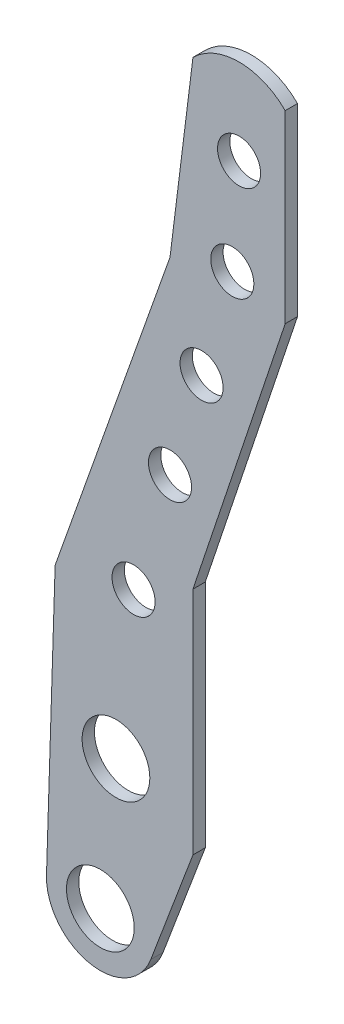
ISO-10303-21;
HEADER;
FILE_DESCRIPTION(('STEP AP214'),'2;1');
FILE_NAME('part.step','',(''),(''),'','','');
FILE_SCHEMA(('AUTOMOTIVE_DESIGN { 1 0 10303 214 1 1 1 1 }'));
ENDSEC;
DATA;
#1=APPLICATION_CONTEXT('core data for automotive mechanical design processes');
#2=APPLICATION_PROTOCOL_DEFINITION('international standard','automotive_design',2000,#1);
#3=PRODUCT_CONTEXT('',#1,'mechanical');
#4=PRODUCT('Part','Part','',(#3));
#5=PRODUCT_RELATED_PRODUCT_CATEGORY('part','',(#4));
#6=PRODUCT_DEFINITION_FORMATION('','',#4);
#7=PRODUCT_DEFINITION_CONTEXT('part definition',#1,'design');
#8=PRODUCT_DEFINITION('design','',#6,#7);
#9=PRODUCT_DEFINITION_SHAPE('','',#8);
#10=(LENGTH_UNIT() NAMED_UNIT(*) SI_UNIT(.MILLI.,.METRE.));
#11=(NAMED_UNIT(*) PLANE_ANGLE_UNIT() SI_UNIT($,.RADIAN.));
#12=(NAMED_UNIT(*) SI_UNIT($,.STERADIAN.) SOLID_ANGLE_UNIT());
#13=UNCERTAINTY_MEASURE_WITH_UNIT(LENGTH_MEASURE(1.E-05),#10,'distance_accuracy_value','');
#14=(GEOMETRIC_REPRESENTATION_CONTEXT(3) GLOBAL_UNCERTAINTY_ASSIGNED_CONTEXT((#13)) GLOBAL_UNIT_ASSIGNED_CONTEXT((#10,
#11,#12)) REPRESENTATION_CONTEXT('',''));
#15=CARTESIAN_POINT('',(0.,0.,0.));
#16=DIRECTION('',(0.,0.,1.));
#17=DIRECTION('',(1.,0.,0.));
#18=AXIS2_PLACEMENT_3D('',#15,#16,#17);
#19=CARTESIAN_POINT('',(0.,0.,4.));
#20=DIRECTION('',(0.,0.,1.));
#21=DIRECTION('',(1.,0.,0.));
#22=AXIS2_PLACEMENT_3D('',#19,#20,#21);
#23=PLANE('',#22);
#24=CARTESIAN_POINT('',(10.7924524437205,95.075946030546,4.));
#25=DIRECTION('',(0.,0.,1.));
#26=DIRECTION('',(1.,0.,0.));
#27=AXIS2_PLACEMENT_3D('',#24,#25,#26);
#28=CIRCLE('',#27,7.00000000000001);
#29=CARTESIAN_POINT('',(17.7924524437206,95.075946030546,4.));
#30=VERTEX_POINT('',#29);
#31=EDGE_CURVE('E224',#30,#30,#28,.T.);
#32=ORIENTED_EDGE('',*,*,#31,.F.);
#33=EDGE_LOOP('',(#32));
#34=FACE_BOUND('',#33,.T.);
#35=CARTESIAN_POINT('',(32.8774007978409,166.36480953983,4.));
#36=DIRECTION('',(0.,0.,1.));
#37=DIRECTION('',(1.,0.,0.));
#38=AXIS2_PLACEMENT_3D('',#35,#36,#37);
#39=CIRCLE('',#38,7.);
#40=CARTESIAN_POINT('',(39.8774007978409,166.36480953983,4.));
#41=VERTEX_POINT('',#40);
#42=EDGE_CURVE('E212',#41,#41,#39,.T.);
#43=ORIENTED_EDGE('',*,*,#42,.F.);
#44=EDGE_LOOP('',(#43));
#45=FACE_BOUND('',#44,.T.);
#46=CARTESIAN_POINT('',(45.0583199970409,232.78813399543,4.));
#47=DIRECTION('',(0.,0.,1.));
#48=DIRECTION('',(1.,0.,0.));
#49=AXIS2_PLACEMENT_3D('',#46,#47,#48);
#50=CIRCLE('',#49,7.);
#51=CARTESIAN_POINT('',(52.0583199970409,232.78813399543,4.));
#52=VERTEX_POINT('',#51);
#53=EDGE_CURVE('E200',#52,#52,#50,.T.);
#54=ORIENTED_EDGE('',*,*,#53,.F.);
#55=EDGE_LOOP('',(#54));
#56=FACE_BOUND('',#55,.T.);
#57=DIRECTION('',(0.353372708393335,0.935482618204507,0.));
#58=VECTOR('',#57,1.);
#59=CARTESIAN_POINT('',(30.0781034684177,30.1028990937833,4.));
#60=LINE('',#59,#58);
#61=CARTESIAN_POINT('',(16.3709458185789,-6.18402239688336,4.));
#62=VERTEX_POINT('',#61);
#63=CARTESIAN_POINT('',(30.0781034684177,30.1028990937833,4.));
#64=VERTEX_POINT('',#63);
#65=EDGE_CURVE('E154',#62,#64,#60,.T.);
#66=ORIENTED_EDGE('',*,*,#65,.T.);
#67=DIRECTION('',(0.,1.,0.));
#68=VECTOR('',#67,1.);
#69=CARTESIAN_POINT('',(30.0781034684177,30.1028990937833,4.));
#70=LINE('',#69,#68);
#71=CARTESIAN_POINT('',(30.0781034684177,104.85863758602,4.));
#72=VERTEX_POINT('',#71);
#73=EDGE_CURVE('E96',#64,#72,#70,.T.);
#74=ORIENTED_EDGE('',*,*,#73,.T.);
#75=DIRECTION('',(0.317032234566605,0.948414762772968,0.));
#76=VECTOR('',#75,1.);
#77=CARTESIAN_POINT('',(30.0781034684177,104.85863758602,4.));
#78=LINE('',#77,#76);
#79=CARTESIAN_POINT('',(60.0385365440409,194.48648593543,4.));
#80=VERTEX_POINT('',#79);
#81=EDGE_CURVE('E171',#72,#80,#78,.T.);
#82=ORIENTED_EDGE('',*,*,#81,.T.);
#83=DIRECTION('',(0.,1.,0.));
#84=VECTOR('',#83,1.);
#85=CARTESIAN_POINT('',(60.0385365440409,194.48648593543,4.));
#86=LINE('',#85,#84);
#87=CARTESIAN_POINT('',(60.0385365440409,254.427096014094,4.));
#88=VERTEX_POINT('',#87);
#89=EDGE_CURVE('E190',#80,#88,#86,.T.);
#90=ORIENTED_EDGE('',*,*,#89,.T.);
#91=CARTESIAN_POINT('',(45.0583199990302,239.446879477041,4.));
#92=DIRECTION('',(0.,0.,1.));
#93=DIRECTION('',(1.,0.,0.));
#94=AXIS2_PLACEMENT_3D('',#91,#92,#93);
#95=CIRCLE('',#94,21.1852253996133);
#96=CARTESIAN_POINT('',(30.0781034688333,254.427096028908,4.));
#97=VERTEX_POINT('',#96);
#98=EDGE_CURVE('E189',#88,#97,#95,.T.);
#99=ORIENTED_EDGE('',*,*,#98,.T.);
#100=DIRECTION('',(-0.123321737923212,-0.992366741157521,0.));
#101=VECTOR('',#100,1.);
#102=CARTESIAN_POINT('',(30.0781034688333,254.427096028908,4.));
#103=LINE('',#102,#101);
#104=CARTESIAN_POINT('',(22.6292643404076,194.486485916155,4.));
#105=VERTEX_POINT('',#104);
#106=EDGE_CURVE('E118',#97,#105,#103,.T.);
#107=ORIENTED_EDGE('',*,*,#106,.T.);
#108=DIRECTION('',(-0.334121974201787,-0.942529843747932,0.));
#109=VECTOR('',#108,1.);
#110=CARTESIAN_POINT('',(22.6292643404076,194.486485916155,4.));
#111=LINE('',#110,#109);
#112=CARTESIAN_POINT('',(-14.6833356527591,89.23079560903,4.));
#113=VERTEX_POINT('',#112);
#114=EDGE_CURVE('E112',#105,#113,#111,.T.);
#115=ORIENTED_EDGE('',*,*,#114,.T.);
#116=DIRECTION('',(-0.0316484884133596,-0.999499061120694,0.));
#117=VECTOR('',#116,1.);
#118=CARTESIAN_POINT('',(-14.6833356527591,89.23079560903,4.));
#119=LINE('',#118,#117);
#120=CARTESIAN_POINT('',(-17.4912335696121,0.553848547233794,4.));
#121=VERTEX_POINT('',#120);
#122=EDGE_CURVE('E116',#113,#121,#119,.T.);
#123=ORIENTED_EDGE('',*,*,#122,.T.);
#124=CARTESIAN_POINT('',(0.,0.,4.));
#125=DIRECTION('',(0.,0.,1.));
#126=DIRECTION('',(1.,0.,0.));
#127=AXIS2_PLACEMENT_3D('',#124,#125,#126);
#128=CIRCLE('',#127,17.5);
#129=EDGE_CURVE('E50',#121,#62,#128,.T.);
#130=ORIENTED_EDGE('',*,*,#129,.T.);
#131=EDGE_LOOP('',(#66,#74,#82,#90,#99,#107,#115,#123,#130));
#132=FACE_BOUND('',#131,.T.);
#133=CARTESIAN_POINT('',(0.,0.,4.));
#134=DIRECTION('',(0.,0.,1.));
#135=DIRECTION('',(1.,0.,0.));
#136=AXIS2_PLACEMENT_3D('',#133,#134,#135);
#137=CIRCLE('',#136,11.);
#138=CARTESIAN_POINT('',(11.,0.,4.));
#139=VERTEX_POINT('',#138);
#140=EDGE_CURVE('E140',#139,#139,#137,.T.);
#141=ORIENTED_EDGE('',*,*,#140,.F.);
#142=EDGE_LOOP('',(#141));
#143=FACE_BOUND('',#142,.T.);
#144=CARTESIAN_POINT('',(42.8551534102409,200.57424703903,4.));
#145=DIRECTION('',(0.,0.,1.));
#146=DIRECTION('',(1.,0.,0.));
#147=AXIS2_PLACEMENT_3D('',#144,#145,#146);
#148=CIRCLE('',#147,7.);
#149=CARTESIAN_POINT('',(49.8551534102409,200.57424703903,4.));
#150=VERTEX_POINT('',#149);
#151=EDGE_CURVE('E206',#150,#150,#148,.T.);
#152=ORIENTED_EDGE('',*,*,#151,.F.);
#153=EDGE_LOOP('',(#152));
#154=FACE_BOUND('',#153,.T.);
#155=CARTESIAN_POINT('',(22.6292643472409,133.28445141823,4.));
#156=DIRECTION('',(0.,0.,1.));
#157=DIRECTION('',(1.,0.,0.));
#158=AXIS2_PLACEMENT_3D('',#155,#156,#157);
#159=CIRCLE('',#158,7.);
#160=CARTESIAN_POINT('',(29.6292643472409,133.28445141823,4.));
#161=VERTEX_POINT('',#160);
#162=EDGE_CURVE('E218',#161,#161,#159,.T.);
#163=ORIENTED_EDGE('',*,*,#162,.F.);
#164=EDGE_LOOP('',(#163));
#165=FACE_BOUND('',#164,.T.);
#166=CARTESIAN_POINT('',(5.07553514772115,44.7128498640407,4.));
#167=DIRECTION('',(0.,0.,1.));
#168=DIRECTION('',(1.,0.,0.));
#169=AXIS2_PLACEMENT_3D('',#166,#167,#168);
#170=CIRCLE('',#169,11.);
#171=CARTESIAN_POINT('',(16.0755351477212,44.7128498640407,4.));
#172=VERTEX_POINT('',#171);
#173=EDGE_CURVE('E230',#172,#172,#170,.T.);
#174=ORIENTED_EDGE('',*,*,#173,.F.);
#175=EDGE_LOOP('',(#174));
#176=FACE_BOUND('',#175,.T.);
#177=ADVANCED_FACE('F33',(#34,#45,#56,#132,#143,#154,#165,#176),#23,.T.);
#178=CARTESIAN_POINT('',(0.,0.,0.));
#179=DIRECTION('',(0.,0.,1.));
#180=DIRECTION('',(1.,0.,0.));
#181=AXIS2_PLACEMENT_3D('',#178,#179,#180);
#182=PLANE('',#181);
#183=DIRECTION('',(0.353372708393335,0.935482618204507,0.));
#184=VECTOR('',#183,1.);
#185=CARTESIAN_POINT('',(30.0781034684177,30.1028990937833,0.));
#186=LINE('',#185,#184);
#187=CARTESIAN_POINT('',(16.3709458185789,-6.18402239688336,0.));
#188=VERTEX_POINT('',#187);
#189=CARTESIAN_POINT('',(30.0781034684177,30.1028990937833,0.));
#190=VERTEX_POINT('',#189);
#191=EDGE_CURVE('E136',#188,#190,#186,.T.);
#192=ORIENTED_EDGE('',*,*,#191,.F.);
#193=CARTESIAN_POINT('',(0.,0.,0.));
#194=DIRECTION('',(0.,0.,1.));
#195=DIRECTION('',(1.,0.,0.));
#196=AXIS2_PLACEMENT_3D('',#193,#194,#195);
#197=CIRCLE('',#196,17.5);
#198=CARTESIAN_POINT('',(-17.4912335696121,0.553848547233794,0.));
#199=VERTEX_POINT('',#198);
#200=EDGE_CURVE('E88',#199,#188,#197,.T.);
#201=ORIENTED_EDGE('',*,*,#200,.F.);
#202=DIRECTION('',(-0.0316484884133596,-0.999499061120694,0.));
#203=VECTOR('',#202,1.);
#204=CARTESIAN_POINT('',(-14.6833356527591,89.23079560903,0.));
#205=LINE('',#204,#203);
#206=CARTESIAN_POINT('',(-14.6833356527591,89.23079560903,0.));
#207=VERTEX_POINT('',#206);
#208=EDGE_CURVE('E82',#207,#199,#205,.T.);
#209=ORIENTED_EDGE('',*,*,#208,.F.);
#210=DIRECTION('',(-0.334121974201787,-0.942529843747932,0.));
#211=VECTOR('',#210,1.);
#212=CARTESIAN_POINT('',(22.6292643404076,194.486485916155,0.));
#213=LINE('',#212,#211);
#214=CARTESIAN_POINT('',(22.6292643404076,194.486485916155,0.));
#215=VERTEX_POINT('',#214);
#216=EDGE_CURVE('E126',#215,#207,#213,.T.);
#217=ORIENTED_EDGE('',*,*,#216,.F.);
#218=DIRECTION('',(-0.123321737923212,-0.992366741157521,0.));
#219=VECTOR('',#218,1.);
#220=CARTESIAN_POINT('',(30.0781034688333,254.427096028908,0.));
#221=LINE('',#220,#219);
#222=CARTESIAN_POINT('',(30.0781034688333,254.427096028908,0.));
#223=VERTEX_POINT('',#222);
#224=EDGE_CURVE('E149',#223,#215,#221,.T.);
#225=ORIENTED_EDGE('',*,*,#224,.F.);
#226=CARTESIAN_POINT('',(45.0583199990302,239.446879477041,0.));
#227=DIRECTION('',(0.,0.,1.));
#228=DIRECTION('',(1.,0.,0.));
#229=AXIS2_PLACEMENT_3D('',#226,#227,#228);
#230=CIRCLE('',#229,21.1852253996133);
#231=CARTESIAN_POINT('',(60.0385365440409,254.427096014094,0.));
#232=VERTEX_POINT('',#231);
#233=EDGE_CURVE('E147',#232,#223,#230,.T.);
#234=ORIENTED_EDGE('',*,*,#233,.F.);
#235=DIRECTION('',(0.,1.,0.));
#236=VECTOR('',#235,1.);
#237=CARTESIAN_POINT('',(60.0385365440409,194.48648593543,0.));
#238=LINE('',#237,#236);
#239=CARTESIAN_POINT('',(60.0385365440409,194.48648593543,0.));
#240=VERTEX_POINT('',#239);
#241=EDGE_CURVE('E145',#240,#232,#238,.T.);
#242=ORIENTED_EDGE('',*,*,#241,.F.);
#243=DIRECTION('',(0.317032234316667,0.948414762856516,0.));
#244=VECTOR('',#243,1.);
#245=CARTESIAN_POINT('',(43.6562346884409,145.47816675643,0.));
#246=LINE('',#245,#244);
#247=CARTESIAN_POINT('',(30.0781034684177,104.85863758602,0.));
#248=VERTEX_POINT('',#247);
#249=EDGE_CURVE('E143',#248,#240,#246,.T.);
#250=ORIENTED_EDGE('',*,*,#249,.F.);
#251=DIRECTION('',(0.,1.,0.));
#252=VECTOR('',#251,1.);
#253=CARTESIAN_POINT('',(30.0781034684177,30.1028990937833,0.));
#254=LINE('',#253,#252);
#255=EDGE_CURVE('E139',#190,#248,#254,.T.);
#256=ORIENTED_EDGE('',*,*,#255,.F.);
#257=EDGE_LOOP('',(#192,#201,#209,#217,#225,#234,#242,#250,#256));
#258=FACE_BOUND('',#257,.T.);
#259=CARTESIAN_POINT('',(0.,0.,0.));
#260=DIRECTION('',(0.,0.,1.));
#261=DIRECTION('',(1.,0.,0.));
#262=AXIS2_PLACEMENT_3D('',#259,#260,#261);
#263=CIRCLE('',#262,11.);
#264=CARTESIAN_POINT('',(11.,0.,0.));
#265=VERTEX_POINT('',#264);
#266=EDGE_CURVE('E197',#265,#265,#263,.T.);
#267=ORIENTED_EDGE('',*,*,#266,.T.);
#268=EDGE_LOOP('',(#267));
#269=FACE_BOUND('',#268,.T.);
#270=CARTESIAN_POINT('',(45.0583199970409,232.78813399543,0.));
#271=DIRECTION('',(0.,0.,1.));
#272=DIRECTION('',(1.,0.,0.));
#273=AXIS2_PLACEMENT_3D('',#270,#271,#272);
#274=CIRCLE('',#273,7.);
#275=CARTESIAN_POINT('',(52.0583199970409,232.78813399543,0.));
#276=VERTEX_POINT('',#275);
#277=EDGE_CURVE('E203',#276,#276,#274,.T.);
#278=ORIENTED_EDGE('',*,*,#277,.T.);
#279=EDGE_LOOP('',(#278));
#280=FACE_BOUND('',#279,.T.);
#281=CARTESIAN_POINT('',(42.8551534102409,200.57424703903,0.));
#282=DIRECTION('',(0.,0.,1.));
#283=DIRECTION('',(1.,0.,0.));
#284=AXIS2_PLACEMENT_3D('',#281,#282,#283);
#285=CIRCLE('',#284,7.);
#286=CARTESIAN_POINT('',(49.8551534102409,200.57424703903,0.));
#287=VERTEX_POINT('',#286);
#288=EDGE_CURVE('E209',#287,#287,#285,.T.);
#289=ORIENTED_EDGE('',*,*,#288,.T.);
#290=EDGE_LOOP('',(#289));
#291=FACE_BOUND('',#290,.T.);
#292=CARTESIAN_POINT('',(32.8774007978409,166.36480953983,0.));
#293=DIRECTION('',(0.,0.,1.));
#294=DIRECTION('',(1.,0.,0.));
#295=AXIS2_PLACEMENT_3D('',#292,#293,#294);
#296=CIRCLE('',#295,7.);
#297=CARTESIAN_POINT('',(39.8774007978409,166.36480953983,0.));
#298=VERTEX_POINT('',#297);
#299=EDGE_CURVE('E215',#298,#298,#296,.T.);
#300=ORIENTED_EDGE('',*,*,#299,.T.);
#301=EDGE_LOOP('',(#300));
#302=FACE_BOUND('',#301,.T.);
#303=CARTESIAN_POINT('',(22.6292643472409,133.28445141823,0.));
#304=DIRECTION('',(0.,0.,1.));
#305=DIRECTION('',(1.,0.,0.));
#306=AXIS2_PLACEMENT_3D('',#303,#304,#305);
#307=CIRCLE('',#306,7.);
#308=CARTESIAN_POINT('',(29.6292643472409,133.28445141823,0.));
#309=VERTEX_POINT('',#308);
#310=EDGE_CURVE('E221',#309,#309,#307,.T.);
#311=ORIENTED_EDGE('',*,*,#310,.T.);
#312=EDGE_LOOP('',(#311));
#313=FACE_BOUND('',#312,.T.);
#314=CARTESIAN_POINT('',(10.7924524437205,95.075946030546,0.));
#315=DIRECTION('',(0.,0.,1.));
#316=DIRECTION('',(1.,0.,0.));
#317=AXIS2_PLACEMENT_3D('',#314,#315,#316);
#318=CIRCLE('',#317,7.00000000000001);
#319=CARTESIAN_POINT('',(17.7924524437206,95.075946030546,0.));
#320=VERTEX_POINT('',#319);
#321=EDGE_CURVE('E227',#320,#320,#318,.T.);
#322=ORIENTED_EDGE('',*,*,#321,.T.);
#323=EDGE_LOOP('',(#322));
#324=FACE_BOUND('',#323,.T.);
#325=CARTESIAN_POINT('',(5.07553514772115,44.7128498640407,0.));
#326=DIRECTION('',(0.,0.,1.));
#327=DIRECTION('',(1.,0.,0.));
#328=AXIS2_PLACEMENT_3D('',#325,#326,#327);
#329=CIRCLE('',#328,11.);
#330=CARTESIAN_POINT('',(16.0755351477212,44.7128498640407,0.));
#331=VERTEX_POINT('',#330);
#332=EDGE_CURVE('E233',#331,#331,#329,.T.);
#333=ORIENTED_EDGE('',*,*,#332,.T.);
#334=EDGE_LOOP('',(#333));
#335=FACE_BOUND('',#334,.T.);
#336=ADVANCED_FACE('F176',(#258,#269,#280,#291,#302,#313,#324,#335),#182,.F.);
#337=CARTESIAN_POINT('',(30.0781034684177,30.1028990937833,4.));
#338=DIRECTION('',(-0.935482618204507,0.353372708393335,0.));
#339=DIRECTION('',(-0.353372708393335,-0.935482618204507,0.));
#340=AXIS2_PLACEMENT_3D('',#337,#338,#339);
#341=PLANE('',#340);
#342=ORIENTED_EDGE('',*,*,#191,.T.);
#343=DIRECTION('',(0.,0.,-1.));
#344=VECTOR('',#343,1.);
#345=CARTESIAN_POINT('',(30.0781034684177,30.1028990937833,4.));
#346=LINE('',#345,#344);
#347=EDGE_CURVE('E11',#64,#190,#346,.T.);
#348=ORIENTED_EDGE('',*,*,#347,.F.);
#349=ORIENTED_EDGE('',*,*,#65,.F.);
#350=DIRECTION('',(0.,0.,-1.));
#351=VECTOR('',#350,1.);
#352=CARTESIAN_POINT('',(16.3709458185789,-6.18402239688336,4.));
#353=LINE('',#352,#351);
#354=EDGE_CURVE('E132',#62,#188,#353,.T.);
#355=ORIENTED_EDGE('',*,*,#354,.T.);
#356=EDGE_LOOP('',(#342,#348,#349,#355));
#357=FACE_BOUND('',#356,.T.);
#358=ADVANCED_FACE('F35',(#357),#341,.F.);
#359=CARTESIAN_POINT('',(30.0781034684177,30.1028990937833,4.));
#360=DIRECTION('',(-1.,0.,0.));
#361=DIRECTION('',(0.,-1.,0.));
#362=AXIS2_PLACEMENT_3D('',#359,#360,#361);
#363=PLANE('',#362);
#364=ORIENTED_EDGE('',*,*,#255,.T.);
#365=DIRECTION('',(0.,0.,-1.));
#366=VECTOR('',#365,1.);
#367=CARTESIAN_POINT('',(30.0781034684177,104.85863758602,4.));
#368=LINE('',#367,#366);
#369=EDGE_CURVE('E42',#72,#248,#368,.T.);
#370=ORIENTED_EDGE('',*,*,#369,.F.);
#371=ORIENTED_EDGE('',*,*,#73,.F.);
#372=ORIENTED_EDGE('',*,*,#347,.T.);
#373=EDGE_LOOP('',(#364,#370,#371,#372));
#374=FACE_BOUND('',#373,.T.);
#375=ADVANCED_FACE('F172',(#374),#363,.F.);
#376=CARTESIAN_POINT('',(43.6562346884409,145.47816675643,4.));
#377=DIRECTION('',(-0.948414762856516,0.317032234316667,0.));
#378=DIRECTION('',(-0.317032234316667,-0.948414762856516,0.));
#379=AXIS2_PLACEMENT_3D('',#376,#377,#378);
#380=PLANE('',#379);
#381=ORIENTED_EDGE('',*,*,#249,.T.);
#382=DIRECTION('',(0.,0.,-1.));
#383=VECTOR('',#382,1.);
#384=CARTESIAN_POINT('',(60.0385365440409,194.48648593543,4.));
#385=LINE('',#384,#383);
#386=EDGE_CURVE('E164',#80,#240,#385,.T.);
#387=ORIENTED_EDGE('',*,*,#386,.F.);
#388=ORIENTED_EDGE('',*,*,#81,.F.);
#389=ORIENTED_EDGE('',*,*,#369,.T.);
#390=EDGE_LOOP('',(#381,#387,#388,#389));
#391=FACE_BOUND('',#390,.T.);
#392=ADVANCED_FACE('F169',(#391),#380,.F.);
#393=CARTESIAN_POINT('',(60.0385365440409,194.48648593543,4.));
#394=DIRECTION('',(-1.,0.,0.));
#395=DIRECTION('',(0.,-1.,0.));
#396=AXIS2_PLACEMENT_3D('',#393,#394,#395);
#397=PLANE('',#396);
#398=ORIENTED_EDGE('',*,*,#241,.T.);
#399=DIRECTION('',(0.,0.,-1.));
#400=VECTOR('',#399,1.);
#401=CARTESIAN_POINT('',(60.0385365440409,254.427096014094,4.));
#402=LINE('',#401,#400);
#403=EDGE_CURVE('E161',#88,#232,#402,.T.);
#404=ORIENTED_EDGE('',*,*,#403,.F.);
#405=ORIENTED_EDGE('',*,*,#89,.F.);
#406=ORIENTED_EDGE('',*,*,#386,.T.);
#407=EDGE_LOOP('',(#398,#404,#405,#406));
#408=FACE_BOUND('',#407,.T.);
#409=ADVANCED_FACE('F183',(#408),#397,.F.);
#410=CARTESIAN_POINT('',(45.0583199990302,239.446879477041,4.));
#411=DIRECTION('',(0.,0.,-1.));
#412=DIRECTION('',(-1.,0.,0.));
#413=AXIS2_PLACEMENT_3D('',#410,#411,#412);
#414=CYLINDRICAL_SURFACE('',#413,21.1852253996133);
#415=ORIENTED_EDGE('',*,*,#233,.T.);
#416=DIRECTION('',(0.,0.,-1.));
#417=VECTOR('',#416,1.);
#418=CARTESIAN_POINT('',(30.0781034688333,254.427096028908,4.));
#419=LINE('',#418,#417);
#420=EDGE_CURVE('E158',#97,#223,#419,.T.);
#421=ORIENTED_EDGE('',*,*,#420,.F.);
#422=ORIENTED_EDGE('',*,*,#98,.F.);
#423=ORIENTED_EDGE('',*,*,#403,.T.);
#424=EDGE_LOOP('',(#415,#421,#422,#423));
#425=FACE_BOUND('',#424,.T.);
#426=ADVANCED_FACE('F187',(#425),#414,.T.);
#427=CARTESIAN_POINT('',(30.0781034688333,254.427096028908,4.));
#428=DIRECTION('',(0.992366741157521,-0.123321737923212,0.));
#429=DIRECTION('',(0.123321737923212,0.992366741157521,0.));
#430=AXIS2_PLACEMENT_3D('',#427,#428,#429);
#431=PLANE('',#430);
#432=ORIENTED_EDGE('',*,*,#224,.T.);
#433=DIRECTION('',(0.,0.,-1.));
#434=VECTOR('',#433,1.);
#435=CARTESIAN_POINT('',(22.6292643404076,194.486485916155,4.));
#436=LINE('',#435,#434);
#437=EDGE_CURVE('E127',#105,#215,#436,.T.);
#438=ORIENTED_EDGE('',*,*,#437,.F.);
#439=ORIENTED_EDGE('',*,*,#106,.F.);
#440=ORIENTED_EDGE('',*,*,#420,.T.);
#441=EDGE_LOOP('',(#432,#438,#439,#440));
#442=FACE_BOUND('',#441,.T.);
#443=ADVANCED_FACE('F262',(#442),#431,.F.);
#444=CARTESIAN_POINT('',(22.6292643404076,194.486485916155,4.));
#445=DIRECTION('',(0.942529843747932,-0.334121974201787,0.));
#446=DIRECTION('',(0.334121974201787,0.942529843747932,0.));
#447=AXIS2_PLACEMENT_3D('',#444,#445,#446);
#448=PLANE('',#447);
#449=ORIENTED_EDGE('',*,*,#216,.T.);
#450=DIRECTION('',(0.,0.,-1.));
#451=VECTOR('',#450,1.);
#452=CARTESIAN_POINT('',(-14.6833356527591,89.23079560903,4.));
#453=LINE('',#452,#451);
#454=EDGE_CURVE('E123',#113,#207,#453,.T.);
#455=ORIENTED_EDGE('',*,*,#454,.F.);
#456=ORIENTED_EDGE('',*,*,#114,.F.);
#457=ORIENTED_EDGE('',*,*,#437,.T.);
#458=EDGE_LOOP('',(#449,#455,#456,#457));
#459=FACE_BOUND('',#458,.T.);
#460=ADVANCED_FACE('F124',(#459),#448,.F.);
#461=CARTESIAN_POINT('',(-14.6833356527591,89.23079560903,4.));
#462=DIRECTION('',(0.999499061120694,-0.0316484884133596,0.));
#463=DIRECTION('',(0.0316484884133596,0.999499061120695,0.));
#464=AXIS2_PLACEMENT_3D('',#461,#462,#463);
#465=PLANE('',#464);
#466=ORIENTED_EDGE('',*,*,#208,.T.);
#467=DIRECTION('',(0.,0.,-1.));
#468=VECTOR('',#467,1.);
#469=CARTESIAN_POINT('',(-17.4912335696121,0.553848547233794,4.));
#470=LINE('',#469,#468);
#471=EDGE_CURVE('E128',#121,#199,#470,.T.);
#472=ORIENTED_EDGE('',*,*,#471,.F.);
#473=ORIENTED_EDGE('',*,*,#122,.F.);
#474=ORIENTED_EDGE('',*,*,#454,.T.);
#475=EDGE_LOOP('',(#466,#472,#473,#474));
#476=FACE_BOUND('',#475,.T.);
#477=ADVANCED_FACE('F130',(#476),#465,.F.);
#478=CARTESIAN_POINT('',(0.,0.,4.));
#479=DIRECTION('',(0.,0.,-1.));
#480=DIRECTION('',(-1.,0.,0.));
#481=AXIS2_PLACEMENT_3D('',#478,#479,#480);
#482=CYLINDRICAL_SURFACE('',#481,17.5);
#483=ORIENTED_EDGE('',*,*,#200,.T.);
#484=ORIENTED_EDGE('',*,*,#354,.F.);
#485=ORIENTED_EDGE('',*,*,#129,.F.);
#486=ORIENTED_EDGE('',*,*,#471,.T.);
#487=EDGE_LOOP('',(#483,#484,#485,#486));
#488=FACE_BOUND('',#487,.T.);
#489=ADVANCED_FACE('F255',(#488),#482,.T.);
#490=CARTESIAN_POINT('',(0.,0.,4.));
#491=DIRECTION('',(0.,0.,-1.));
#492=DIRECTION('',(-1.,0.,0.));
#493=AXIS2_PLACEMENT_3D('',#490,#491,#492);
#494=CYLINDRICAL_SURFACE('',#493,11.);
#495=ORIENTED_EDGE('',*,*,#140,.T.);
#496=EDGE_LOOP('',(#495));
#497=FACE_BOUND('',#496,.T.);
#498=ORIENTED_EDGE('',*,*,#266,.F.);
#499=EDGE_LOOP('',(#498));
#500=FACE_BOUND('',#499,.T.);
#501=ADVANCED_FACE('F252',(#497,#500),#494,.F.);
#502=CARTESIAN_POINT('',(45.0583199970409,232.78813399543,4.));
#503=DIRECTION('',(0.,0.,-1.));
#504=DIRECTION('',(-1.,0.,0.));
#505=AXIS2_PLACEMENT_3D('',#502,#503,#504);
#506=CYLINDRICAL_SURFACE('',#505,7.);
#507=ORIENTED_EDGE('',*,*,#53,.T.);
#508=EDGE_LOOP('',(#507));
#509=FACE_BOUND('',#508,.T.);
#510=ORIENTED_EDGE('',*,*,#277,.F.);
#511=EDGE_LOOP('',(#510));
#512=FACE_BOUND('',#511,.T.);
#513=ADVANCED_FACE('F341',(#509,#512),#506,.F.);
#514=CARTESIAN_POINT('',(42.8551534102409,200.57424703903,4.));
#515=DIRECTION('',(0.,0.,-1.));
#516=DIRECTION('',(-1.,0.,0.));
#517=AXIS2_PLACEMENT_3D('',#514,#515,#516);
#518=CYLINDRICAL_SURFACE('',#517,7.);
#519=ORIENTED_EDGE('',*,*,#151,.T.);
#520=EDGE_LOOP('',(#519));
#521=FACE_BOUND('',#520,.T.);
#522=ORIENTED_EDGE('',*,*,#288,.F.);
#523=EDGE_LOOP('',(#522));
#524=FACE_BOUND('',#523,.T.);
#525=ADVANCED_FACE('F349',(#521,#524),#518,.F.);
#526=CARTESIAN_POINT('',(32.8774007978409,166.36480953983,4.));
#527=DIRECTION('',(0.,0.,-1.));
#528=DIRECTION('',(-1.,0.,0.));
#529=AXIS2_PLACEMENT_3D('',#526,#527,#528);
#530=CYLINDRICAL_SURFACE('',#529,7.);
#531=ORIENTED_EDGE('',*,*,#42,.T.);
#532=EDGE_LOOP('',(#531));
#533=FACE_BOUND('',#532,.T.);
#534=ORIENTED_EDGE('',*,*,#299,.F.);
#535=EDGE_LOOP('',(#534));
#536=FACE_BOUND('',#535,.T.);
#537=ADVANCED_FACE('F357',(#533,#536),#530,.F.);
#538=CARTESIAN_POINT('',(22.6292643472409,133.28445141823,4.));
#539=DIRECTION('',(0.,0.,-1.));
#540=DIRECTION('',(-1.,0.,0.));
#541=AXIS2_PLACEMENT_3D('',#538,#539,#540);
#542=CYLINDRICAL_SURFACE('',#541,7.);
#543=ORIENTED_EDGE('',*,*,#162,.T.);
#544=EDGE_LOOP('',(#543));
#545=FACE_BOUND('',#544,.T.);
#546=ORIENTED_EDGE('',*,*,#310,.F.);
#547=EDGE_LOOP('',(#546));
#548=FACE_BOUND('',#547,.T.);
#549=ADVANCED_FACE('F366',(#545,#548),#542,.F.);
#550=CARTESIAN_POINT('',(10.7924524437205,95.075946030546,4.));
#551=DIRECTION('',(0.,0.,-1.));
#552=DIRECTION('',(-1.,0.,0.));
#553=AXIS2_PLACEMENT_3D('',#550,#551,#552);
#554=CYLINDRICAL_SURFACE('',#553,7.00000000000001);
#555=ORIENTED_EDGE('',*,*,#31,.T.);
#556=EDGE_LOOP('',(#555));
#557=FACE_BOUND('',#556,.T.);
#558=ORIENTED_EDGE('',*,*,#321,.F.);
#559=EDGE_LOOP('',(#558));
#560=FACE_BOUND('',#559,.T.);
#561=ADVANCED_FACE('F375',(#557,#560),#554,.F.);
#562=CARTESIAN_POINT('',(5.07553514772115,44.7128498640407,4.));
#563=DIRECTION('',(0.,0.,-1.));
#564=DIRECTION('',(-1.,0.,0.));
#565=AXIS2_PLACEMENT_3D('',#562,#563,#564);
#566=CYLINDRICAL_SURFACE('',#565,11.);
#567=ORIENTED_EDGE('',*,*,#173,.T.);
#568=EDGE_LOOP('',(#567));
#569=FACE_BOUND('',#568,.T.);
#570=ORIENTED_EDGE('',*,*,#332,.F.);
#571=EDGE_LOOP('',(#570));
#572=FACE_BOUND('',#571,.T.);
#573=ADVANCED_FACE('F239',(#569,#572),#566,.F.);
#574=CLOSED_SHELL('',(#177,#336,#358,#375,#392,#409,#426,#443,#460,#477,#489,#501,#513,#525,
#537,#549,#561,#573));
#575=MANIFOLD_SOLID_BREP('B2',#574);
#576=ADVANCED_BREP_SHAPE_REPRESENTATION('',(#18,#575),#14);
#577=SHAPE_DEFINITION_REPRESENTATION(#9,#576);
ENDSEC;
END-ISO-10303-21;
